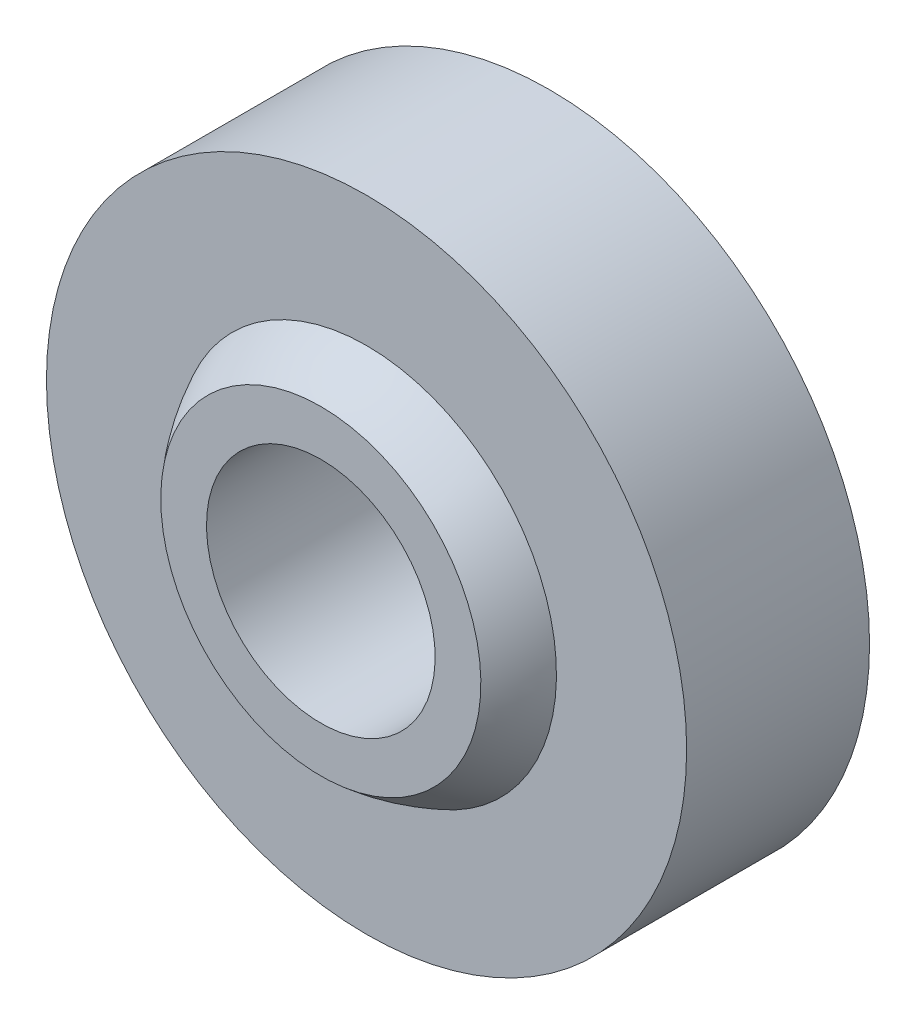
ISO-10303-21;
HEADER;
FILE_DESCRIPTION(('STEP AP214'),'2;1');
FILE_NAME('part.step','',(''),(''),'','','');
FILE_SCHEMA(('AUTOMOTIVE_DESIGN { 1 0 10303 214 1 1 1 1 }'));
ENDSEC;
DATA;
#1=APPLICATION_CONTEXT('core data for automotive mechanical design processes');
#2=APPLICATION_PROTOCOL_DEFINITION('international standard','automotive_design',2000,#1);
#3=PRODUCT_CONTEXT('',#1,'mechanical');
#4=PRODUCT('Part','Part','',(#3));
#5=PRODUCT_RELATED_PRODUCT_CATEGORY('part','',(#4));
#6=PRODUCT_DEFINITION_FORMATION('','',#4);
#7=PRODUCT_DEFINITION_CONTEXT('part definition',#1,'design');
#8=PRODUCT_DEFINITION('design','',#6,#7);
#9=PRODUCT_DEFINITION_SHAPE('','',#8);
#10=(LENGTH_UNIT() NAMED_UNIT(*) SI_UNIT(.MILLI.,.METRE.));
#11=(NAMED_UNIT(*) PLANE_ANGLE_UNIT() SI_UNIT($,.RADIAN.));
#12=(NAMED_UNIT(*) SI_UNIT($,.STERADIAN.) SOLID_ANGLE_UNIT());
#13=UNCERTAINTY_MEASURE_WITH_UNIT(LENGTH_MEASURE(1.E-05),#10,'distance_accuracy_value','');
#14=(GEOMETRIC_REPRESENTATION_CONTEXT(3) GLOBAL_UNCERTAINTY_ASSIGNED_CONTEXT((#13)) GLOBAL_UNIT_ASSIGNED_CONTEXT((#10,
#11,#12)) REPRESENTATION_CONTEXT('',''));
#15=CARTESIAN_POINT('',(0.,0.,0.));
#16=DIRECTION('',(0.,0.,1.));
#17=DIRECTION('',(1.,0.,0.));
#18=AXIS2_PLACEMENT_3D('',#15,#16,#17);
#19=CARTESIAN_POINT('',(0.,0.,2.));
#20=DIRECTION('',(0.,0.,1.));
#21=DIRECTION('',(1.,0.,0.));
#22=AXIS2_PLACEMENT_3D('',#19,#20,#21);
#23=PLANE('',#22);
#24=CARTESIAN_POINT('',(0.,0.,2.));
#25=DIRECTION('',(0.,0.,1.));
#26=DIRECTION('',(1.,0.,0.));
#27=AXIS2_PLACEMENT_3D('',#24,#25,#26);
#28=CIRCLE('',#27,7.);
#29=CARTESIAN_POINT('',(7.,0.,2.));
#30=VERTEX_POINT('',#29);
#31=EDGE_CURVE('E53',#30,#30,#28,.T.);
#32=ORIENTED_EDGE('',*,*,#31,.T.);
#33=EDGE_LOOP('',(#32));
#34=FACE_BOUND('',#33,.T.);
#35=CARTESIAN_POINT('',(0.,0.,2.));
#36=DIRECTION('',(0.,0.,1.));
#37=DIRECTION('',(1.,0.,0.));
#38=AXIS2_PLACEMENT_3D('',#35,#36,#37);
#39=CIRCLE('',#38,4.15331193145904);
#40=CARTESIAN_POINT('',(0.,4.15331193145904,2.));
#41=VERTEX_POINT('',#40);
#42=EDGE_CURVE('E64',#41,#41,#39,.F.);
#43=ORIENTED_EDGE('',*,*,#42,.T.);
#44=EDGE_LOOP('',(#43));
#45=FACE_BOUND('',#44,.T.);
#46=ADVANCED_FACE('F45',(#34,#45),#23,.T.);
#47=CARTESIAN_POINT('',(0.,0.,-2.));
#48=DIRECTION('',(0.,0.,1.));
#49=DIRECTION('',(1.,0.,0.));
#50=AXIS2_PLACEMENT_3D('',#47,#48,#49);
#51=PLANE('',#50);
#52=CARTESIAN_POINT('',(0.,0.,-2.));
#53=DIRECTION('',(0.,0.,1.));
#54=DIRECTION('',(1.,0.,0.));
#55=AXIS2_PLACEMENT_3D('',#52,#53,#54);
#56=CIRCLE('',#55,7.);
#57=CARTESIAN_POINT('',(7.,0.,-2.));
#58=VERTEX_POINT('',#57);
#59=EDGE_CURVE('E58',#58,#58,#56,.T.);
#60=ORIENTED_EDGE('',*,*,#59,.F.);
#61=EDGE_LOOP('',(#60));
#62=FACE_BOUND('',#61,.T.);
#63=CARTESIAN_POINT('',(0.,0.,-2.));
#64=DIRECTION('',(0.,0.,1.));
#65=DIRECTION('',(1.,0.,0.));
#66=AXIS2_PLACEMENT_3D('',#63,#64,#65);
#67=CIRCLE('',#66,4.15331193145904);
#68=CARTESIAN_POINT('',(0.,4.15331193145904,-2.));
#69=VERTEX_POINT('',#68);
#70=EDGE_CURVE('E10',#69,#69,#67,.F.);
#71=ORIENTED_EDGE('',*,*,#70,.F.);
#72=EDGE_LOOP('',(#71));
#73=FACE_BOUND('',#72,.T.);
#74=ADVANCED_FACE('F99',(#62,#73),#51,.F.);
#75=CARTESIAN_POINT('',(0.,0.,2.));
#76=DIRECTION('',(0.,0.,-1.));
#77=DIRECTION('',(-1.,0.,0.));
#78=AXIS2_PLACEMENT_3D('',#75,#76,#77);
#79=CYLINDRICAL_SURFACE('',#78,7.);
#80=ORIENTED_EDGE('',*,*,#31,.F.);
#81=EDGE_LOOP('',(#80));
#82=FACE_BOUND('',#81,.T.);
#83=ORIENTED_EDGE('',*,*,#59,.T.);
#84=EDGE_LOOP('',(#83));
#85=FACE_BOUND('',#84,.T.);
#86=ADVANCED_FACE('F47',(#82,#85),#79,.T.);
#87=CARTESIAN_POINT('',(0.,0.,0.));
#88=DIRECTION('',(0.,0.,-1.));
#89=DIRECTION('',(0.,1.,0.));
#90=AXIS2_PLACEMENT_3D('',#87,#88,#89);
#91=SPHERICAL_SURFACE('',#90,4.60977222864644);
#92=CARTESIAN_POINT('',(0.,0.,-3.));
#93=DIRECTION('',(0.,0.,-1.));
#94=DIRECTION('',(0.,1.,0.));
#95=AXIS2_PLACEMENT_3D('',#92,#93,#94);
#96=CIRCLE('',#95,3.5);
#97=CARTESIAN_POINT('',(0.,3.5,-3.));
#98=VERTEX_POINT('',#97);
#99=EDGE_CURVE('E81',#98,#98,#96,.T.);
#100=CARTESIAN_POINT('',(0.,3.5,-3.));
#101=CARTESIAN_POINT('',(0.,3.50812039634238,-2.99052620611061));
#102=CARTESIAN_POINT('',(0.,3.51620232540534,-2.98101944028967));
#103=CARTESIAN_POINT('',(0.,3.53228872007487,-2.96194059506185));
#104=CARTESIAN_POINT('',(0.,3.54029318568143,-2.95236851565497));
#105=CARTESIAN_POINT('',(0.,3.55622412454056,-2.93315967353245));
#106=CARTESIAN_POINT('',(0.,3.56415059779313,-2.92352291081681));
#107=CARTESIAN_POINT('',(0.,3.57992502955823,-2.90418533777321));
#108=CARTESIAN_POINT('',(0.,3.58777298807076,-2.89448452744525));
#109=CARTESIAN_POINT('',(0.,3.60338987278029,-2.87501949878755));
#110=CARTESIAN_POINT('',(0.,3.61115879897729,-2.86525528045781));
#111=CARTESIAN_POINT('',(0.,3.62661710678996,-2.8456640796711));
#112=CARTESIAN_POINT('',(0.,3.63430648840563,-2.83583709721413));
#113=CARTESIAN_POINT('',(0.,3.64960520000871,-2.81612101616401));
#114=CARTESIAN_POINT('',(0.,3.65721452999613,-2.80623191757086));
#115=CARTESIAN_POINT('',(0.,3.67235263658149,-2.78639225634135));
#116=CARTESIAN_POINT('',(0.,3.67988141317943,-2.77644169370499));
#117=CARTESIAN_POINT('',(0.,3.69485791653445,-2.75647976053338));
#118=CARTESIAN_POINT('',(0.,3.70230564329153,-2.74646838999813));
#119=CARTESIAN_POINT('',(0.,3.71711955585841,-2.72638550118322));
#120=CARTESIAN_POINT('',(0.,3.7244857416682,-2.71631398290356));
#121=CARTESIAN_POINT('',(0.,3.73913608661081,-2.69611146272033));
#122=CARTESIAN_POINT('',(0.,3.74642024574362,-2.68598046081677));
#123=CARTESIAN_POINT('',(0.,3.76090605701146,-2.66565964142868));
#124=CARTESIAN_POINT('',(0.,3.76810770914649,-2.65546982394415));
#125=CARTESIAN_POINT('',(0.,3.78242803153852,-2.63503204531536));
#126=CARTESIAN_POINT('',(0.,3.78954670179551,-2.6247840841711));
#127=CARTESIAN_POINT('',(0.,3.80370059102309,-2.60423069397813));
#128=CARTESIAN_POINT('',(0.,3.81073580999366,-2.59392526492941));
#129=CARTESIAN_POINT('',(0.,3.82472233274282,-2.57325761847225));
#130=CARTESIAN_POINT('',(0.,3.83167363652141,-2.56289540106381));
#131=CARTESIAN_POINT('',(0.,3.84549187051441,-2.54211486117656));
#132=CARTESIAN_POINT('',(0.,3.85235880072884,-2.53169653869776));
#133=CARTESIAN_POINT('',(0.,3.866007834785,-2.51080447565878));
#134=CARTESIAN_POINT('',(0.,3.87278993862674,-2.5003307350986));
#135=CARTESIAN_POINT('',(0.,3.88626887272247,-2.47932852654012));
#136=CARTESIAN_POINT('',(0.,3.89296570297647,-2.46880005854182));
#137=CARTESIAN_POINT('',(0.,3.90627364830467,-2.44768908935913));
#138=CARTESIAN_POINT('',(0.,3.91288476337887,-2.43710658817473));
#139=CARTESIAN_POINT('',(0.,3.9260208424075,-2.41588825043483));
#140=CARTESIAN_POINT('',(0.,3.93254580636193,-2.40525241387933));
#141=CARTESIAN_POINT('',(0.,3.94550915289192,-2.38392810672916));
#142=CARTESIAN_POINT('',(0.,3.95194753546746,-2.3732396361345));
#143=CARTESIAN_POINT('',(0.,3.96473729468976,-2.35181076570868));
#144=CARTESIAN_POINT('',(0.,3.97108867133652,-2.34107036587753));
#145=CARTESIAN_POINT('',(0.,3.98370399988854,-2.31953834520562));
#146=CARTESIAN_POINT('',(0.,3.9899679517938,-2.30874672436486));
#147=CARTESIAN_POINT('',(0.,4.002408017815,-2.28711297327821));
#148=CARTESIAN_POINT('',(0.,4.00858413193093,-2.27627084303231));
#149=CARTESIAN_POINT('',(0.,4.02084811511754,-2.25453678807035));
#150=CARTESIAN_POINT('',(0.,4.02693598418822,-2.2436448633543));
#151=CARTESIAN_POINT('',(0.,4.03902307584791,-2.22181193767078));
#152=CARTESIAN_POINT('',(0.,4.04502229843691,-2.21087093670332));
#153=CARTESIAN_POINT('',(0.,4.05693170154001,-2.18894057997077));
#154=CARTESIAN_POINT('',(0.,4.0628418820541,-2.17795122420567));
#155=CARTESIAN_POINT('',(0.,4.07457281129388,-2.15592488252423));
#156=CARTESIAN_POINT('',(0.,4.08039356001957,-2.14488789660788));
#157=CARTESIAN_POINT('',(0.,4.09194524183532,-2.12276702239587));
#158=CARTESIAN_POINT('',(0.,4.09767617492539,-2.11168313410021));
#159=CARTESIAN_POINT('',(0.,4.1090478476605,-2.08946918605098));
#160=CARTESIAN_POINT('',(0.,4.11468858730555,-2.07833912629741));
#161=CARTESIAN_POINT('',(0.,4.12587950085816,-2.05603356908673));
#162=CARTESIAN_POINT('',(0.,4.13142967476571,-2.04485807162961));
#163=CARTESIAN_POINT('',(0.,4.14243909212941,-2.02246237655214));
#164=CARTESIAN_POINT('',(0.,4.14789833558556,-2.01124217893179));
#165=CARTESIAN_POINT('',(0.,4.15331193145904,-2.));
#166=B_SPLINE_CURVE_WITH_KNOTS('',3,(#100,#101,#102,#103,#104,#105,#106,#107,#108,#109,#110,
#111,#112,#113,#114,#115,#116,#117,#118,#119,#120,#121,#122,#123,#124,#125,#126,#127,#128,#129,
#130,#131,#132,#133,#134,#135,#136,#137,#138,#139,#140,#141,#142,#143,#144,#145,#146,#147,#148,
#149,#150,#151,#152,#153,#154,#155,#156,#157,#158,#159,#160,#161,#162,#163,#164,#165),
.UNSPECIFIED.,.F.,.F.,(4,2,2,2,2,2,2,2,2,2,2,2,2,2,2,2,2,2,2,2,2,2,2,2,2,2,2,2,2,2,2,2,4),(0.,
0.0374330704687176,0.0748661409374357,0.112299211406154,0.149732281874872,0.187165352343589,
0.224598422812307,0.262031493281025,0.299464563749743,0.336897634218461,0.374330704687179,
0.411763775155896,0.449196845624614,0.486629916093333,0.524062986562051,0.561496057030769,
0.598929127499486,0.636362197968204,0.673795268436922,0.71122833890564,0.748661409374357,
0.786094479843076,0.823527550311794,0.860960620780511,0.898393691249229,0.935826761717948,
0.973259832186665,1.01069290265538,1.0481259731241,1.08555904359282,1.12299211406154,
1.16042518453025,1.19785825499897),.UNSPECIFIED.);
#167=EDGE_CURVE('BSEAM89',#98,#69,#166,.T.);
#168=ORIENTED_EDGE('',*,*,#99,.F.);
#169=ORIENTED_EDGE('',*,*,#70,.T.);
#170=ORIENTED_EDGE('',*,*,#167,.T.);
#171=ORIENTED_EDGE('',*,*,#167,.F.);
#172=EDGE_LOOP('',(#168,#170,#169,#171));
#173=FACE_BOUND('',#172,.T.);
#174=ADVANCED_FACE('F89',(#173),#91,.T.);
#175=CARTESIAN_POINT('',(0.,0.,-3.));
#176=DIRECTION('',(0.,0.,-1.));
#177=DIRECTION('',(0.,1.,0.));
#178=AXIS2_PLACEMENT_3D('',#175,#176,#177);
#179=PLANE('',#178);
#180=ORIENTED_EDGE('',*,*,#99,.T.);
#181=EDGE_LOOP('',(#180));
#182=FACE_BOUND('',#181,.T.);
#183=CARTESIAN_POINT('',(0.,0.,-3.));
#184=DIRECTION('',(0.,0.,-1.));
#185=DIRECTION('',(0.,1.,0.));
#186=AXIS2_PLACEMENT_3D('',#183,#184,#185);
#187=CIRCLE('',#186,2.5);
#188=CARTESIAN_POINT('',(0.,2.5,-3.));
#189=VERTEX_POINT('',#188);
#190=EDGE_CURVE('E77',#189,#189,#187,.T.);
#191=ORIENTED_EDGE('',*,*,#190,.F.);
#192=EDGE_LOOP('',(#191));
#193=FACE_BOUND('',#192,.T.);
#194=ADVANCED_FACE('F86',(#182,#193),#179,.T.);
#195=CARTESIAN_POINT('',(0.,0.,2.));
#196=DIRECTION('',(0.,0.,-1.));
#197=DIRECTION('',(-1.,0.,0.));
#198=AXIS2_PLACEMENT_3D('',#195,#196,#197);
#199=CYLINDRICAL_SURFACE('',#198,2.5);
#200=ORIENTED_EDGE('',*,*,#190,.T.);
#201=EDGE_LOOP('',(#200));
#202=FACE_BOUND('',#201,.T.);
#203=CARTESIAN_POINT('',(0.,0.,3.));
#204=DIRECTION('',(0.,0.,-1.));
#205=DIRECTION('',(0.,1.,0.));
#206=AXIS2_PLACEMENT_3D('',#203,#204,#205);
#207=CIRCLE('',#206,2.5);
#208=CARTESIAN_POINT('',(0.,2.5,3.));
#209=VERTEX_POINT('',#208);
#210=EDGE_CURVE('E73',#209,#209,#207,.T.);
#211=ORIENTED_EDGE('',*,*,#210,.F.);
#212=EDGE_LOOP('',(#211));
#213=FACE_BOUND('',#212,.T.);
#214=ADVANCED_FACE('F97',(#202,#213),#199,.F.);
#215=CARTESIAN_POINT('',(0.,0.,3.));
#216=DIRECTION('',(0.,0.,-1.));
#217=DIRECTION('',(0.,1.,0.));
#218=AXIS2_PLACEMENT_3D('',#215,#216,#217);
#219=CIRCLE('',#218,3.5);
#220=CARTESIAN_POINT('',(0.,3.5,3.));
#221=VERTEX_POINT('',#220);
#222=EDGE_CURVE('E69',#221,#221,#219,.T.);
#223=CARTESIAN_POINT('',(0.,4.15331193145904,2.));
#224=CARTESIAN_POINT('',(0.,4.14789833558556,2.01124217893179));
#225=CARTESIAN_POINT('',(0.,4.14243909212941,2.02246237655214));
#226=CARTESIAN_POINT('',(0.,4.13142967476571,2.04485807162961));
#227=CARTESIAN_POINT('',(0.,4.12587950085816,2.05603356908673));
#228=CARTESIAN_POINT('',(0.,4.11468858730555,2.07833912629741));
#229=CARTESIAN_POINT('',(0.,4.1090478476605,2.08946918605098));
#230=CARTESIAN_POINT('',(0.,4.09767617492538,2.11168313410021));
#231=CARTESIAN_POINT('',(0.,4.09194524183532,2.12276702239587));
#232=CARTESIAN_POINT('',(0.,4.08039356001957,2.14488789660788));
#233=CARTESIAN_POINT('',(0.,4.07457281129388,2.15592488252423));
#234=CARTESIAN_POINT('',(0.,4.0628418820541,2.17795122420567));
#235=CARTESIAN_POINT('',(0.,4.05693170154001,2.18894057997077));
#236=CARTESIAN_POINT('',(0.,4.04502229843691,2.21087093670332));
#237=CARTESIAN_POINT('',(0.,4.03902307584791,2.22181193767078));
#238=CARTESIAN_POINT('',(0.,4.02693598418822,2.2436448633543));
#239=CARTESIAN_POINT('',(0.,4.02084811511754,2.25453678807035));
#240=CARTESIAN_POINT('',(0.,4.00858413193093,2.27627084303231));
#241=CARTESIAN_POINT('',(0.,4.002408017815,2.28711297327821));
#242=CARTESIAN_POINT('',(0.,3.9899679517938,2.30874672436486));
#243=CARTESIAN_POINT('',(0.,3.98370399988854,2.31953834520562));
#244=CARTESIAN_POINT('',(0.,3.97108867133652,2.34107036587753));
#245=CARTESIAN_POINT('',(0.,3.96473729468976,2.35181076570868));
#246=CARTESIAN_POINT('',(0.,3.95194753546746,2.3732396361345));
#247=CARTESIAN_POINT('',(0.,3.94550915289192,2.38392810672916));
#248=CARTESIAN_POINT('',(0.,3.93254580636193,2.40525241387933));
#249=CARTESIAN_POINT('',(0.,3.9260208424075,2.41588825043483));
#250=CARTESIAN_POINT('',(0.,3.91288476337887,2.43710658817473));
#251=CARTESIAN_POINT('',(0.,3.90627364830467,2.44768908935913));
#252=CARTESIAN_POINT('',(0.,3.89296570297647,2.46880005854182));
#253=CARTESIAN_POINT('',(0.,3.88626887272247,2.47932852654012));
#254=CARTESIAN_POINT('',(0.,3.87278993862674,2.5003307350986));
#255=CARTESIAN_POINT('',(0.,3.866007834785,2.51080447565878));
#256=CARTESIAN_POINT('',(0.,3.85235880072884,2.53169653869776));
#257=CARTESIAN_POINT('',(0.,3.84549187051441,2.54211486117656));
#258=CARTESIAN_POINT('',(0.,3.8316736365214,2.5628954010638));
#259=CARTESIAN_POINT('',(0.,3.82472233274282,2.57325761847225));
#260=CARTESIAN_POINT('',(0.,3.81073580999366,2.59392526492941));
#261=CARTESIAN_POINT('',(0.,3.80370059102309,2.60423069397813));
#262=CARTESIAN_POINT('',(0.,3.78954670179551,2.6247840841711));
#263=CARTESIAN_POINT('',(0.,3.78242803153852,2.63503204531536));
#264=CARTESIAN_POINT('',(0.,3.76810770914649,2.65546982394415));
#265=CARTESIAN_POINT('',(0.,3.76090605701146,2.66565964142868));
#266=CARTESIAN_POINT('',(0.,3.74642024574362,2.68598046081677));
#267=CARTESIAN_POINT('',(0.,3.73913608661081,2.69611146272033));
#268=CARTESIAN_POINT('',(0.,3.7244857416682,2.71631398290356));
#269=CARTESIAN_POINT('',(0.,3.71711955585841,2.72638550118322));
#270=CARTESIAN_POINT('',(0.,3.70230564329153,2.74646838999813));
#271=CARTESIAN_POINT('',(0.,3.69485791653445,2.75647976053338));
#272=CARTESIAN_POINT('',(0.,3.67988141317943,2.77644169370499));
#273=CARTESIAN_POINT('',(0.,3.67235263658149,2.78639225634135));
#274=CARTESIAN_POINT('',(0.,3.65721452999613,2.80623191757086));
#275=CARTESIAN_POINT('',(0.,3.64960520000871,2.81612101616401));
#276=CARTESIAN_POINT('',(0.,3.63430648840563,2.83583709721413));
#277=CARTESIAN_POINT('',(0.,3.62661710678996,2.8456640796711));
#278=CARTESIAN_POINT('',(0.,3.61115879897729,2.86525528045781));
#279=CARTESIAN_POINT('',(0.,3.60338987278029,2.87501949878755));
#280=CARTESIAN_POINT('',(0.,3.58777298807076,2.89448452744525));
#281=CARTESIAN_POINT('',(0.,3.57992502955823,2.90418533777321));
#282=CARTESIAN_POINT('',(0.,3.56415059779313,2.92352291081681));
#283=CARTESIAN_POINT('',(0.,3.55622412454056,2.93315967353245));
#284=CARTESIAN_POINT('',(0.,3.54029318568143,2.95236851565497));
#285=CARTESIAN_POINT('',(0.,3.53228872007487,2.96194059506185));
#286=CARTESIAN_POINT('',(0.,3.51620232540534,2.98101944028967));
#287=CARTESIAN_POINT('',(0.,3.50812039634238,2.99052620611061));
#288=CARTESIAN_POINT('',(0.,3.5,3.));
#289=B_SPLINE_CURVE_WITH_KNOTS('',3,(#223,#224,#225,#226,#227,#228,#229,#230,#231,#232,#233,
#234,#235,#236,#237,#238,#239,#240,#241,#242,#243,#244,#245,#246,#247,#248,#249,#250,#251,#252,
#253,#254,#255,#256,#257,#258,#259,#260,#261,#262,#263,#264,#265,#266,#267,#268,#269,#270,#271,
#272,#273,#274,#275,#276,#277,#278,#279,#280,#281,#282,#283,#284,#285,#286,#287,#288),
.UNSPECIFIED.,.F.,.F.,(4,2,2,2,2,2,2,2,2,2,2,2,2,2,2,2,2,2,2,2,2,2,2,2,2,2,2,2,2,2,2,2,4),(0.,
0.0374330704687179,0.0748661409374359,0.112299211406154,0.149732281874872,0.18716535234359,
0.224598422812307,0.262031493281025,0.299464563749743,0.336897634218461,0.374330704687179,
0.411763775155897,0.449196845624614,0.486629916093332,0.524062986562051,0.561496057030768,
0.598929127499486,0.636362197968204,0.673795268436922,0.71122833890564,0.748661409374358,
0.786094479843075,0.823527550311793,0.860960620780512,0.898393691249229,0.935826761717947,
0.973259832186665,1.01069290265538,1.0481259731241,1.08555904359282,1.12299211406154,
1.16042518453025,1.19785825499897),.UNSPECIFIED.);
#290=EDGE_CURVE('BSEAM92',#41,#221,#289,.T.);
#291=ORIENTED_EDGE('',*,*,#42,.F.);
#292=ORIENTED_EDGE('',*,*,#222,.T.);
#293=ORIENTED_EDGE('',*,*,#290,.T.);
#294=ORIENTED_EDGE('',*,*,#290,.F.);
#295=EDGE_LOOP('',(#291,#293,#292,#294));
#296=FACE_BOUND('',#295,.T.);
#297=ADVANCED_FACE('F92',(#296),#91,.T.);
#298=CARTESIAN_POINT('',(0.,0.,3.));
#299=DIRECTION('',(0.,0.,-1.));
#300=DIRECTION('',(0.,1.,0.));
#301=AXIS2_PLACEMENT_3D('',#298,#299,#300);
#302=PLANE('',#301);
#303=ORIENTED_EDGE('',*,*,#222,.F.);
#304=EDGE_LOOP('',(#303));
#305=FACE_BOUND('',#304,.T.);
#306=ORIENTED_EDGE('',*,*,#210,.T.);
#307=EDGE_LOOP('',(#306));
#308=FACE_BOUND('',#307,.T.);
#309=ADVANCED_FACE('F104',(#305,#308),#302,.F.);
#310=CLOSED_SHELL('',(#46,#74,#86,#174,#194,#214,#297,#309));
#311=MANIFOLD_SOLID_BREP('B2',#310);
#312=ADVANCED_BREP_SHAPE_REPRESENTATION('',(#18,#311),#14);
#313=SHAPE_DEFINITION_REPRESENTATION(#9,#312);
ENDSEC;
END-ISO-10303-21;
